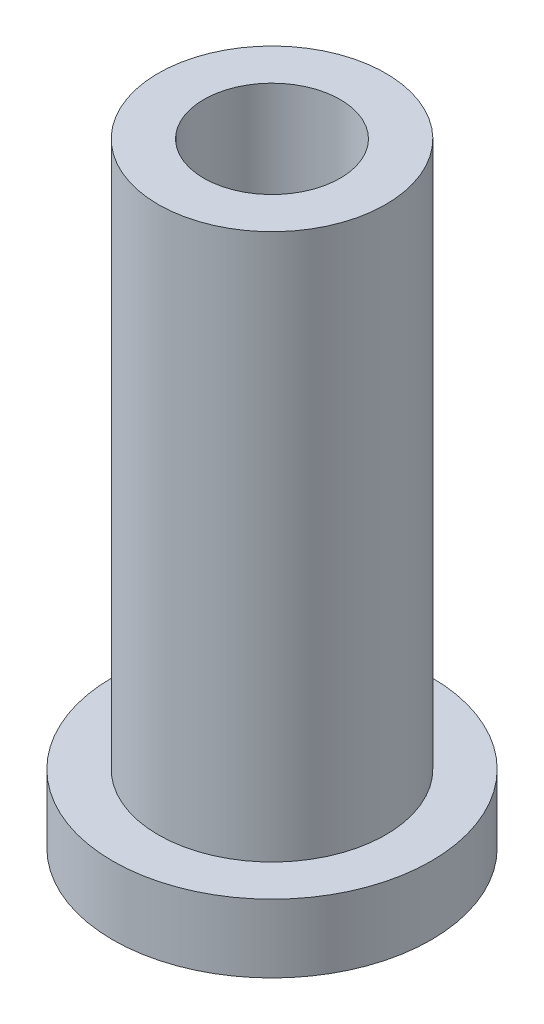
ISO-10303-21;
HEADER;
FILE_DESCRIPTION(('STEP AP214'),'2;1');
FILE_NAME('part.step','',(''),(''),'','','');
FILE_SCHEMA(('AUTOMOTIVE_DESIGN { 1 0 10303 214 1 1 1 1 }'));
ENDSEC;
DATA;
#1=APPLICATION_CONTEXT('core data for automotive mechanical design processes');
#2=APPLICATION_PROTOCOL_DEFINITION('international standard','automotive_design',2000,#1);
#3=PRODUCT_CONTEXT('',#1,'mechanical');
#4=PRODUCT('Part','Part','',(#3));
#5=PRODUCT_RELATED_PRODUCT_CATEGORY('part','',(#4));
#6=PRODUCT_DEFINITION_FORMATION('','',#4);
#7=PRODUCT_DEFINITION_CONTEXT('part definition',#1,'design');
#8=PRODUCT_DEFINITION('design','',#6,#7);
#9=PRODUCT_DEFINITION_SHAPE('','',#8);
#10=(LENGTH_UNIT() NAMED_UNIT(*) SI_UNIT(.MILLI.,.METRE.));
#11=(NAMED_UNIT(*) PLANE_ANGLE_UNIT() SI_UNIT($,.RADIAN.));
#12=(NAMED_UNIT(*) SI_UNIT($,.STERADIAN.) SOLID_ANGLE_UNIT());
#13=UNCERTAINTY_MEASURE_WITH_UNIT(LENGTH_MEASURE(1.E-05),#10,'distance_accuracy_value','');
#14=(GEOMETRIC_REPRESENTATION_CONTEXT(3) GLOBAL_UNCERTAINTY_ASSIGNED_CONTEXT((#13)) GLOBAL_UNIT_ASSIGNED_CONTEXT((#10,
#11,#12)) REPRESENTATION_CONTEXT('',''));
#15=CARTESIAN_POINT('',(0.,0.,0.));
#16=DIRECTION('',(0.,0.,1.));
#17=DIRECTION('',(1.,0.,0.));
#18=AXIS2_PLACEMENT_3D('',#15,#16,#17);
#19=CARTESIAN_POINT('',(10.,40.3414634146341,0.));
#20=DIRECTION('',(0.,-1.,0.));
#21=DIRECTION('',(0.,0.,-1.));
#22=AXIS2_PLACEMENT_3D('',#19,#20,#21);
#23=PLANE('',#22);
#24=CARTESIAN_POINT('',(0.,40.3414634146341,0.));
#25=DIRECTION('',(0.,1.,0.));
#26=DIRECTION('',(0.,0.,1.));
#27=AXIS2_PLACEMENT_3D('',#24,#25,#26);
#28=CIRCLE('',#27,6.);
#29=CARTESIAN_POINT('',(0.,40.3414634146341,6.));
#30=VERTEX_POINT('',#29);
#31=EDGE_CURVE('E10',#30,#30,#28,.T.);
#32=ORIENTED_EDGE('',*,*,#31,.F.);
#33=EDGE_LOOP('',(#32));
#34=FACE_BOUND('',#33,.T.);
#35=CARTESIAN_POINT('',(0.,40.3414634146341,0.));
#36=DIRECTION('',(0.,1.,0.));
#37=DIRECTION('',(0.,0.,1.));
#38=AXIS2_PLACEMENT_3D('',#35,#36,#37);
#39=CIRCLE('',#38,10.);
#40=CARTESIAN_POINT('',(0.,40.3414634146341,10.));
#41=VERTEX_POINT('',#40);
#42=EDGE_CURVE('E53',#41,#41,#39,.T.);
#43=ORIENTED_EDGE('',*,*,#42,.T.);
#44=EDGE_LOOP('',(#43));
#45=FACE_BOUND('',#44,.T.);
#46=ADVANCED_FACE('F31',(#34,#45),#23,.F.);
#47=CARTESIAN_POINT('',(0.,18.3414634146342,0.));
#48=DIRECTION('',(0.,1.,0.));
#49=DIRECTION('',(0.,0.,1.));
#50=AXIS2_PLACEMENT_3D('',#47,#48,#49);
#51=CYLINDRICAL_SURFACE('',#50,6.00000000000001);
#52=CARTESIAN_POINT('',(0.,-13.6585365853659,0.));
#53=DIRECTION('',(0.,1.,0.));
#54=DIRECTION('',(0.,0.,1.));
#55=AXIS2_PLACEMENT_3D('',#52,#53,#54);
#56=CIRCLE('',#55,6.00000000000001);
#57=CARTESIAN_POINT('',(0.,-13.6585365853659,6.00000000000001));
#58=VERTEX_POINT('',#57);
#59=EDGE_CURVE('E37',#58,#58,#56,.T.);
#60=ORIENTED_EDGE('',*,*,#59,.F.);
#61=EDGE_LOOP('',(#60));
#62=FACE_BOUND('',#61,.T.);
#63=ORIENTED_EDGE('',*,*,#31,.T.);
#64=EDGE_LOOP('',(#63));
#65=FACE_BOUND('',#64,.T.);
#66=ADVANCED_FACE('F78',(#62,#65),#51,.F.);
#67=CARTESIAN_POINT('',(6.00000000000001,-13.6585365853659,0.));
#68=DIRECTION('',(0.,1.,0.));
#69=DIRECTION('',(0.,0.,1.));
#70=AXIS2_PLACEMENT_3D('',#67,#68,#69);
#71=PLANE('',#70);
#72=CARTESIAN_POINT('',(0.,-13.6585365853659,0.));
#73=DIRECTION('',(0.,1.,0.));
#74=DIRECTION('',(0.,0.,1.));
#75=AXIS2_PLACEMENT_3D('',#72,#73,#74);
#76=CIRCLE('',#75,14.);
#77=CARTESIAN_POINT('',(0.,-13.6585365853659,14.));
#78=VERTEX_POINT('',#77);
#79=EDGE_CURVE('E41',#78,#78,#76,.T.);
#80=ORIENTED_EDGE('',*,*,#79,.F.);
#81=EDGE_LOOP('',(#80));
#82=FACE_BOUND('',#81,.T.);
#83=ORIENTED_EDGE('',*,*,#59,.T.);
#84=EDGE_LOOP('',(#83));
#85=FACE_BOUND('',#84,.T.);
#86=ADVANCED_FACE('F73',(#82,#85),#71,.F.);
#87=CARTESIAN_POINT('',(0.,18.3414634146342,0.));
#88=DIRECTION('',(0.,1.,0.));
#89=DIRECTION('',(0.,0.,1.));
#90=AXIS2_PLACEMENT_3D('',#87,#88,#89);
#91=CYLINDRICAL_SURFACE('',#90,14.);
#92=CARTESIAN_POINT('',(0.,-7.65853658536588,0.));
#93=DIRECTION('',(0.,1.,0.));
#94=DIRECTION('',(0.,0.,1.));
#95=AXIS2_PLACEMENT_3D('',#92,#93,#94);
#96=CIRCLE('',#95,14.);
#97=CARTESIAN_POINT('',(0.,-7.65853658536588,14.));
#98=VERTEX_POINT('',#97);
#99=EDGE_CURVE('E45',#98,#98,#96,.T.);
#100=ORIENTED_EDGE('',*,*,#99,.F.);
#101=EDGE_LOOP('',(#100));
#102=FACE_BOUND('',#101,.T.);
#103=ORIENTED_EDGE('',*,*,#79,.T.);
#104=EDGE_LOOP('',(#103));
#105=FACE_BOUND('',#104,.T.);
#106=ADVANCED_FACE('F67',(#102,#105),#91,.T.);
#107=CARTESIAN_POINT('',(14.,-7.65853658536589,0.));
#108=DIRECTION('',(0.,-1.,0.));
#109=DIRECTION('',(0.,0.,-1.));
#110=AXIS2_PLACEMENT_3D('',#107,#108,#109);
#111=PLANE('',#110);
#112=CARTESIAN_POINT('',(0.,-7.65853658536589,0.));
#113=DIRECTION('',(0.,1.,0.));
#114=DIRECTION('',(0.,0.,1.));
#115=AXIS2_PLACEMENT_3D('',#112,#113,#114);
#116=CIRCLE('',#115,10.);
#117=CARTESIAN_POINT('',(0.,-7.65853658536589,10.));
#118=VERTEX_POINT('',#117);
#119=EDGE_CURVE('E50',#118,#118,#116,.T.);
#120=ORIENTED_EDGE('',*,*,#119,.F.);
#121=EDGE_LOOP('',(#120));
#122=FACE_BOUND('',#121,.T.);
#123=ORIENTED_EDGE('',*,*,#99,.T.);
#124=EDGE_LOOP('',(#123));
#125=FACE_BOUND('',#124,.T.);
#126=ADVANCED_FACE('F61',(#122,#125),#111,.F.);
#127=CARTESIAN_POINT('',(0.,18.3414634146342,0.));
#128=DIRECTION('',(0.,1.,0.));
#129=DIRECTION('',(0.,0.,1.));
#130=AXIS2_PLACEMENT_3D('',#127,#128,#129);
#131=CYLINDRICAL_SURFACE('',#130,10.);
#132=ORIENTED_EDGE('',*,*,#42,.F.);
#133=EDGE_LOOP('',(#132));
#134=FACE_BOUND('',#133,.T.);
#135=ORIENTED_EDGE('',*,*,#119,.T.);
#136=EDGE_LOOP('',(#135));
#137=FACE_BOUND('',#136,.T.);
#138=ADVANCED_FACE('F58',(#134,#137),#131,.T.);
#139=CLOSED_SHELL('',(#46,#66,#86,#106,#126,#138));
#140=MANIFOLD_SOLID_BREP('B2',#139);
#141=ADVANCED_BREP_SHAPE_REPRESENTATION('',(#18,#140),#14);
#142=SHAPE_DEFINITION_REPRESENTATION(#9,#141);
ENDSEC;
END-ISO-10303-21;
